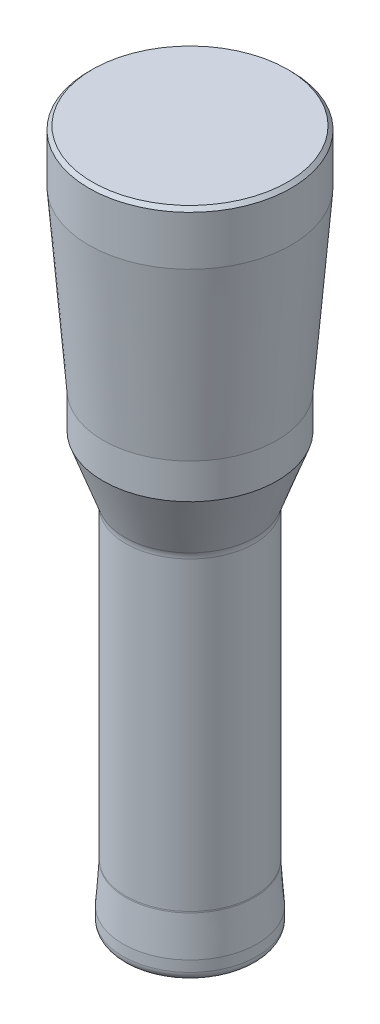
ISO-10303-21;
HEADER;
FILE_DESCRIPTION(('STEP AP214'),'2;1');
FILE_NAME('part.step','',(''),(''),'','','');
FILE_SCHEMA(('AUTOMOTIVE_DESIGN { 1 0 10303 214 1 1 1 1 }'));
ENDSEC;
DATA;
#1=APPLICATION_CONTEXT('core data for automotive mechanical design processes');
#2=APPLICATION_PROTOCOL_DEFINITION('international standard','automotive_design',2000,#1);
#3=PRODUCT_CONTEXT('',#1,'mechanical');
#4=PRODUCT('Part','Part','',(#3));
#5=PRODUCT_RELATED_PRODUCT_CATEGORY('part','',(#4));
#6=PRODUCT_DEFINITION_FORMATION('','',#4);
#7=PRODUCT_DEFINITION_CONTEXT('part definition',#1,'design');
#8=PRODUCT_DEFINITION('design','',#6,#7);
#9=PRODUCT_DEFINITION_SHAPE('','',#8);
#10=(LENGTH_UNIT() NAMED_UNIT(*) SI_UNIT(.MILLI.,.METRE.));
#11=(NAMED_UNIT(*) PLANE_ANGLE_UNIT() SI_UNIT($,.RADIAN.));
#12=(NAMED_UNIT(*) SI_UNIT($,.STERADIAN.) SOLID_ANGLE_UNIT());
#13=UNCERTAINTY_MEASURE_WITH_UNIT(LENGTH_MEASURE(1.E-05),#10,'distance_accuracy_value','');
#14=(GEOMETRIC_REPRESENTATION_CONTEXT(3) GLOBAL_UNCERTAINTY_ASSIGNED_CONTEXT((#13)) GLOBAL_UNIT_ASSIGNED_CONTEXT((#10,
#11,#12)) REPRESENTATION_CONTEXT('',''));
#15=CARTESIAN_POINT('',(0.,0.,0.));
#16=DIRECTION('',(0.,0.,1.));
#17=DIRECTION('',(1.,0.,0.));
#18=AXIS2_PLACEMENT_3D('',#15,#16,#17);
#19=CARTESIAN_POINT('',(0.,198.039004785883,0.));
#20=DIRECTION('',(0.,1.,0.));
#21=DIRECTION('',(0.,0.,1.));
#22=AXIS2_PLACEMENT_3D('',#19,#20,#21);
#23=CYLINDRICAL_SURFACE('',#22,18.2367638986598);
#24=CARTESIAN_POINT('',(0.,17.7397746373049,0.));
#25=DIRECTION('',(0.,1.,0.));
#26=DIRECTION('',(0.,0.,1.));
#27=AXIS2_PLACEMENT_3D('',#24,#25,#26);
#28=CIRCLE('',#27,18.2367638986599);
#29=CARTESIAN_POINT('',(0.,17.7397746373049,18.2367638986599));
#30=VERTEX_POINT('',#29);
#31=EDGE_CURVE('E44',#30,#30,#28,.T.);
#32=ORIENTED_EDGE('',*,*,#31,.T.);
#33=EDGE_LOOP('',(#32));
#34=FACE_BOUND('',#33,.T.);
#35=CARTESIAN_POINT('',(0.,104.399774637305,0.));
#36=DIRECTION('',(0.,1.,0.));
#37=DIRECTION('',(0.,0.,1.));
#38=AXIS2_PLACEMENT_3D('',#35,#36,#37);
#39=CIRCLE('',#38,18.2367638986598);
#40=CARTESIAN_POINT('',(0.,104.399774637305,18.2367638986598));
#41=VERTEX_POINT('',#40);
#42=EDGE_CURVE('E77',#41,#41,#39,.T.);
#43=ORIENTED_EDGE('',*,*,#42,.F.);
#44=EDGE_LOOP('',(#43));
#45=FACE_BOUND('',#44,.T.);
#46=ADVANCED_FACE('F33',(#34,#45),#23,.T.);
#47=CARTESIAN_POINT('',(0.,17.7397746373049,0.));
#48=DIRECTION('',(0.,1.,0.));
#49=DIRECTION('',(0.,0.,1.));
#50=AXIS2_PLACEMENT_3D('',#47,#48,#49);
#51=TOROIDAL_SURFACE('',#50,23.2367638986599,5.);
#52=CARTESIAN_POINT('',(0.,17.3909922685843,0.));
#53=DIRECTION('',(0.,1.,0.));
#54=DIRECTION('',(0.,0.,1.));
#55=AXIS2_PLACEMENT_3D('',#52,#53,#54);
#56=CIRCLE('',#55,18.2489436473608);
#57=CARTESIAN_POINT('',(0.,17.3909922685843,18.2489436473608));
#58=VERTEX_POINT('',#57);
#59=EDGE_CURVE('E48',#58,#58,#56,.T.);
#60=ORIENTED_EDGE('',*,*,#59,.T.);
#61=EDGE_LOOP('',(#60));
#62=FACE_BOUND('',#61,.T.);
#63=ORIENTED_EDGE('',*,*,#31,.F.);
#64=EDGE_LOOP('',(#63));
#65=FACE_BOUND('',#64,.T.);
#66=ADVANCED_FACE('F84',(#62,#65),#51,.F.);
#67=CARTESIAN_POINT('',(0.,17.3909922685843,0.));
#68=DIRECTION('',(0.,-1.,0.));
#69=DIRECTION('',(0.,0.,-1.));
#70=AXIS2_PLACEMENT_3D('',#67,#68,#69);
#71=CONICAL_SURFACE('',#70,18.2489436473608,0.0698131700797724);
#72=CARTESIAN_POINT('',(0.,6.36437270437307,0.));
#73=DIRECTION('',(0.,1.,0.));
#74=DIRECTION('',(0.,0.,1.));
#75=AXIS2_PLACEMENT_3D('',#72,#73,#74);
#76=CIRCLE('',#75,19.02);
#77=CARTESIAN_POINT('',(0.,6.36437270437307,19.02));
#78=VERTEX_POINT('',#77);
#79=EDGE_CURVE('E53',#78,#78,#76,.T.);
#80=ORIENTED_EDGE('',*,*,#79,.T.);
#81=EDGE_LOOP('',(#80));
#82=FACE_BOUND('',#81,.T.);
#83=ORIENTED_EDGE('',*,*,#59,.F.);
#84=EDGE_LOOP('',(#83));
#85=FACE_BOUND('',#84,.T.);
#86=ADVANCED_FACE('F89',(#82,#85),#71,.T.);
#87=CARTESIAN_POINT('',(0.,198.039004785883,0.));
#88=DIRECTION('',(0.,1.,0.));
#89=DIRECTION('',(0.,0.,1.));
#90=AXIS2_PLACEMENT_3D('',#87,#88,#89);
#91=CYLINDRICAL_SURFACE('',#90,19.02);
#92=CARTESIAN_POINT('',(0.,3.3075379541318,0.));
#93=DIRECTION('',(0.,1.,0.));
#94=DIRECTION('',(0.,0.,1.));
#95=AXIS2_PLACEMENT_3D('',#92,#93,#94);
#96=CIRCLE('',#95,19.02);
#97=CARTESIAN_POINT('',(0.,3.3075379541318,19.02));
#98=VERTEX_POINT('',#97);
#99=EDGE_CURVE('E56',#98,#98,#96,.T.);
#100=ORIENTED_EDGE('',*,*,#99,.T.);
#101=EDGE_LOOP('',(#100));
#102=FACE_BOUND('',#101,.T.);
#103=ORIENTED_EDGE('',*,*,#79,.F.);
#104=EDGE_LOOP('',(#103));
#105=FACE_BOUND('',#104,.T.);
#106=ADVANCED_FACE('F95',(#102,#105),#91,.T.);
#107=CARTESIAN_POINT('',(0.,3.30753795413181,0.));
#108=DIRECTION('',(0.,1.,0.));
#109=DIRECTION('',(0.,0.,1.));
#110=AXIS2_PLACEMENT_3D('',#107,#108,#109);
#111=TOROIDAL_SURFACE('',#110,16.3712,2.64879999999918);
#112=CARTESIAN_POINT('',(0.,0.681398805326611,0.));
#113=DIRECTION('',(0.,1.,0.));
#114=DIRECTION('',(0.,0.,1.));
#115=AXIS2_PLACEMENT_3D('',#112,#113,#114);
#116=CIRCLE('',#115,16.7169377779532);
#117=CARTESIAN_POINT('',(0.,0.681398805326611,16.7169377779532));
#118=VERTEX_POINT('',#117);
#119=EDGE_CURVE('E59',#118,#118,#116,.T.);
#120=ORIENTED_EDGE('',*,*,#119,.T.);
#121=EDGE_LOOP('',(#120));
#122=FACE_BOUND('',#121,.T.);
#123=ORIENTED_EDGE('',*,*,#99,.F.);
#124=EDGE_LOOP('',(#123));
#125=FACE_BOUND('',#124,.T.);
#126=ADVANCED_FACE('F99',(#122,#125),#111,.T.);
#127=CARTESIAN_POINT('',(0.,0.,0.));
#128=DIRECTION('',(0.,1.,0.));
#129=DIRECTION('',(0.,0.,1.));
#130=AXIS2_PLACEMENT_3D('',#127,#128,#129);
#131=CONICAL_SURFACE('',#130,11.5412,1.43989663289501);
#132=ORIENTED_EDGE('',*,*,#119,.F.);
#133=EDGE_LOOP('',(#132));
#134=FACE_BOUND('',#133,.T.);
#135=CARTESIAN_POINT('',(0.,0.,0.));
#136=DIRECTION('',(0.,1.,0.));
#137=DIRECTION('',(0.,0.,1.));
#138=AXIS2_PLACEMENT_3D('',#135,#136,#137);
#139=CIRCLE('',#138,11.5412);
#140=CARTESIAN_POINT('',(0.,0.,11.5412));
#141=VERTEX_POINT('',#140);
#142=EDGE_CURVE('E62',#141,#141,#139,.T.);
#143=ORIENTED_EDGE('',*,*,#142,.T.);
#144=EDGE_LOOP('',(#143));
#145=FACE_BOUND('',#144,.T.);
#146=ADVANCED_FACE('F103',(#134,#145),#131,.T.);
#147=CARTESIAN_POINT('',(0.,0.,0.));
#148=DIRECTION('',(0.,1.,0.));
#149=DIRECTION('',(0.,0.,1.));
#150=AXIS2_PLACEMENT_3D('',#147,#148,#149);
#151=PLANE('',#150);
#152=ORIENTED_EDGE('',*,*,#142,.F.);
#153=EDGE_LOOP('',(#152));
#154=FACE_BOUND('',#153,.T.);
#155=ADVANCED_FACE('F107',(#154),#151,.F.);
#156=CARTESIAN_POINT('',(0.,198.039004785883,0.));
#157=DIRECTION('',(0.,-1.,0.));
#158=DIRECTION('',(0.,0.,-1.));
#159=AXIS2_PLACEMENT_3D('',#156,#157,#158);
#160=PLANE('',#159);
#161=CARTESIAN_POINT('',(0.,198.039004785883,0.));
#162=DIRECTION('',(0.,-1.,0.));
#163=DIRECTION('',(0.,0.,-1.));
#164=AXIS2_PLACEMENT_3D('',#161,#162,#163);
#165=CIRCLE('',#164,27.7199999999999);
#166=CARTESIAN_POINT('',(0.,198.039004785883,-27.7199999999999));
#167=VERTEX_POINT('',#166);
#168=EDGE_CURVE('E40',#167,#167,#165,.F.);
#169=ORIENTED_EDGE('',*,*,#168,.T.);
#170=EDGE_LOOP('',(#169));
#171=FACE_BOUND('',#170,.T.);
#172=ADVANCED_FACE('F111',(#171),#160,.F.);
#173=CARTESIAN_POINT('',(0.,198.039004785883,0.));
#174=DIRECTION('',(0.,1.,0.));
#175=DIRECTION('',(0.,0.,1.));
#176=AXIS2_PLACEMENT_3D('',#173,#174,#175);
#177=CYLINDRICAL_SURFACE('',#176,28.72);
#178=CARTESIAN_POINT('',(0.,197.039004785883,0.));
#179=DIRECTION('',(0.,-1.,0.));
#180=DIRECTION('',(0.,0.,-1.));
#181=AXIS2_PLACEMENT_3D('',#178,#179,#180);
#182=CIRCLE('',#181,28.72);
#183=CARTESIAN_POINT('',(0.,197.039004785883,-28.72));
#184=VERTEX_POINT('',#183);
#185=EDGE_CURVE('E10',#184,#184,#182,.T.);
#186=ORIENTED_EDGE('',*,*,#185,.T.);
#187=EDGE_LOOP('',(#186));
#188=FACE_BOUND('',#187,.T.);
#189=CARTESIAN_POINT('',(0.,183.039004785883,0.));
#190=DIRECTION('',(0.,1.,0.));
#191=DIRECTION('',(0.,0.,1.));
#192=AXIS2_PLACEMENT_3D('',#189,#190,#191);
#193=CIRCLE('',#192,28.72);
#194=CARTESIAN_POINT('',(0.,183.039004785883,28.72));
#195=VERTEX_POINT('',#194);
#196=EDGE_CURVE('E65',#195,#195,#193,.T.);
#197=ORIENTED_EDGE('',*,*,#196,.T.);
#198=EDGE_LOOP('',(#197));
#199=FACE_BOUND('',#198,.T.);
#200=ADVANCED_FACE('F115',(#188,#199),#177,.T.);
#201=CARTESIAN_POINT('',(0.,133.039004785883,0.));
#202=DIRECTION('',(0.,1.,0.));
#203=DIRECTION('',(0.,0.,1.));
#204=AXIS2_PLACEMENT_3D('',#201,#202,#203);
#205=CONICAL_SURFACE('',#204,24.6999999999999,0.0802274293338037);
#206=ORIENTED_EDGE('',*,*,#196,.F.);
#207=EDGE_LOOP('',(#206));
#208=FACE_BOUND('',#207,.T.);
#209=CARTESIAN_POINT('',(0.,133.039004785883,0.));
#210=DIRECTION('',(0.,1.,0.));
#211=DIRECTION('',(0.,0.,1.));
#212=AXIS2_PLACEMENT_3D('',#209,#210,#211);
#213=CIRCLE('',#212,24.6999999999999);
#214=CARTESIAN_POINT('',(0.,133.039004785883,24.6999999999999));
#215=VERTEX_POINT('',#214);
#216=EDGE_CURVE('E68',#215,#215,#213,.T.);
#217=ORIENTED_EDGE('',*,*,#216,.T.);
#218=EDGE_LOOP('',(#217));
#219=FACE_BOUND('',#218,.T.);
#220=ADVANCED_FACE('F118',(#208,#219),#205,.T.);
#221=CARTESIAN_POINT('',(0.,198.039004785883,0.));
#222=DIRECTION('',(0.,1.,0.));
#223=DIRECTION('',(0.,0.,1.));
#224=AXIS2_PLACEMENT_3D('',#221,#222,#223);
#225=CYLINDRICAL_SURFACE('',#224,24.6999999999999);
#226=ORIENTED_EDGE('',*,*,#216,.F.);
#227=EDGE_LOOP('',(#226));
#228=FACE_BOUND('',#227,.T.);
#229=CARTESIAN_POINT('',(0.,123.039004785883,0.));
#230=DIRECTION('',(0.,1.,0.));
#231=DIRECTION('',(0.,0.,1.));
#232=AXIS2_PLACEMENT_3D('',#229,#230,#231);
#233=CIRCLE('',#232,24.6999999999999);
#234=CARTESIAN_POINT('',(0.,123.039004785883,24.6999999999999));
#235=VERTEX_POINT('',#234);
#236=EDGE_CURVE('E71',#235,#235,#233,.T.);
#237=ORIENTED_EDGE('',*,*,#236,.T.);
#238=EDGE_LOOP('',(#237));
#239=FACE_BOUND('',#238,.T.);
#240=ADVANCED_FACE('F121',(#228,#239),#225,.T.);
#241=CARTESIAN_POINT('',(0.,106.109875353933,0.));
#242=DIRECTION('',(0.,1.,0.));
#243=DIRECTION('',(0.,0.,1.));
#244=AXIS2_PLACEMENT_3D('',#241,#242,#243);
#245=CONICAL_SURFACE('',#244,18.5383007947303,0.349065850398867);
#246=ORIENTED_EDGE('',*,*,#236,.F.);
#247=EDGE_LOOP('',(#246));
#248=FACE_BOUND('',#247,.T.);
#249=CARTESIAN_POINT('',(0.,106.109875353933,0.));
#250=DIRECTION('',(0.,1.,0.));
#251=DIRECTION('',(0.,0.,1.));
#252=AXIS2_PLACEMENT_3D('',#249,#250,#251);
#253=CIRCLE('',#252,18.5383007947303);
#254=CARTESIAN_POINT('',(0.,106.109875353933,18.5383007947303));
#255=VERTEX_POINT('',#254);
#256=EDGE_CURVE('E74',#255,#255,#253,.T.);
#257=ORIENTED_EDGE('',*,*,#256,.T.);
#258=EDGE_LOOP('',(#257));
#259=FACE_BOUND('',#258,.T.);
#260=ADVANCED_FACE('F125',(#248,#259),#245,.T.);
#261=CARTESIAN_POINT('',(0.,104.399774637305,0.));
#262=DIRECTION('',(0.,1.,0.));
#263=DIRECTION('',(0.,0.,1.));
#264=AXIS2_PLACEMENT_3D('',#261,#262,#263);
#265=TOROIDAL_SURFACE('',#264,23.2367638986598,5.);
#266=ORIENTED_EDGE('',*,*,#256,.F.);
#267=EDGE_LOOP('',(#266));
#268=FACE_BOUND('',#267,.T.);
#269=ORIENTED_EDGE('',*,*,#42,.T.);
#270=EDGE_LOOP('',(#269));
#271=FACE_BOUND('',#270,.T.);
#272=ADVANCED_FACE('F81',(#268,#271),#265,.F.);
#273=CARTESIAN_POINT('',(0.,198.039004785883,0.));
#274=DIRECTION('',(0.,-1.,0.));
#275=DIRECTION('',(0.,0.,-1.));
#276=AXIS2_PLACEMENT_3D('',#273,#274,#275);
#277=CONICAL_SURFACE('',#276,27.7199999999999,0.785398163397438);
#278=ORIENTED_EDGE('',*,*,#185,.F.);
#279=EDGE_LOOP('',(#278));
#280=FACE_BOUND('',#279,.T.);
#281=ORIENTED_EDGE('',*,*,#168,.F.);
#282=EDGE_LOOP('',(#281));
#283=FACE_BOUND('',#282,.T.);
#284=ADVANCED_FACE('F35',(#280,#283),#277,.T.);
#285=CLOSED_SHELL('',(#46,#66,#86,#106,#126,#146,#155,#172,#200,#220,#240,#260,#272,#284));
#286=MANIFOLD_SOLID_BREP('B2',#285);
#287=ADVANCED_BREP_SHAPE_REPRESENTATION('',(#18,#286),#14);
#288=SHAPE_DEFINITION_REPRESENTATION(#9,#287);
ENDSEC;
END-ISO-10303-21;
